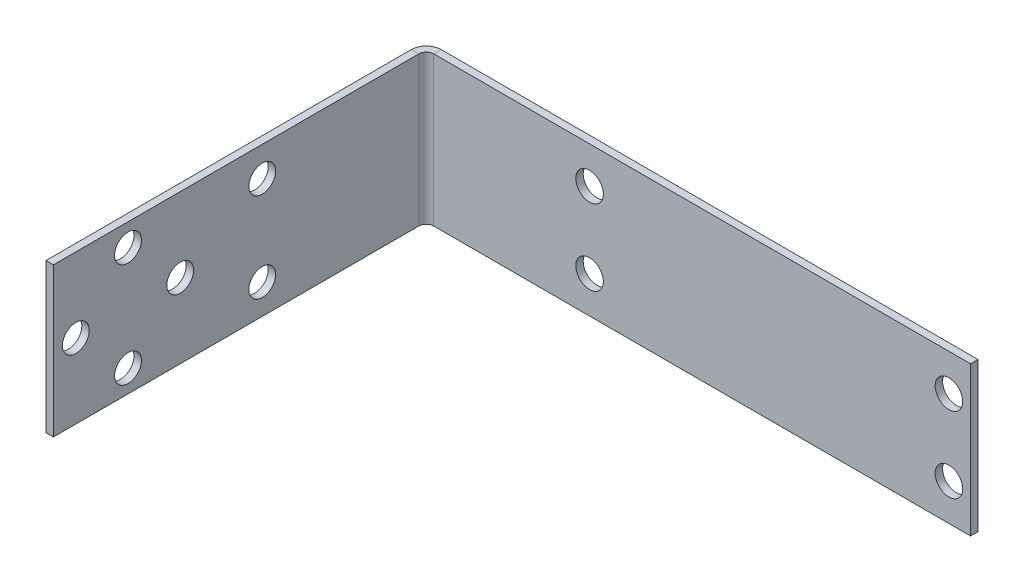
ISO-10303-21;
HEADER;
FILE_DESCRIPTION(('STEP AP214'),'2;1');
FILE_NAME('part.step','',(''),(''),'','','');
FILE_SCHEMA(('AUTOMOTIVE_DESIGN { 1 0 10303 214 1 1 1 1 }'));
ENDSEC;
DATA;
#1=APPLICATION_CONTEXT('core data for automotive mechanical design processes');
#2=APPLICATION_PROTOCOL_DEFINITION('international standard','automotive_design',2000,#1);
#3=PRODUCT_CONTEXT('',#1,'mechanical');
#4=PRODUCT('Part','Part','',(#3));
#5=PRODUCT_RELATED_PRODUCT_CATEGORY('part','',(#4));
#6=PRODUCT_DEFINITION_FORMATION('','',#4);
#7=PRODUCT_DEFINITION_CONTEXT('part definition',#1,'design');
#8=PRODUCT_DEFINITION('design','',#6,#7);
#9=PRODUCT_DEFINITION_SHAPE('','',#8);
#10=(LENGTH_UNIT() NAMED_UNIT(*) SI_UNIT(.MILLI.,.METRE.));
#11=(NAMED_UNIT(*) PLANE_ANGLE_UNIT() SI_UNIT($,.RADIAN.));
#12=(NAMED_UNIT(*) SI_UNIT($,.STERADIAN.) SOLID_ANGLE_UNIT());
#13=UNCERTAINTY_MEASURE_WITH_UNIT(LENGTH_MEASURE(1.E-05),#10,'distance_accuracy_value','');
#14=(GEOMETRIC_REPRESENTATION_CONTEXT(3) GLOBAL_UNCERTAINTY_ASSIGNED_CONTEXT((#13)) GLOBAL_UNIT_ASSIGNED_CONTEXT((#10,
#11,#12)) REPRESENTATION_CONTEXT('',''));
#15=CARTESIAN_POINT('',(0.,0.,0.));
#16=DIRECTION('',(0.,0.,1.));
#17=DIRECTION('',(1.,0.,0.));
#18=AXIS2_PLACEMENT_3D('',#15,#16,#17);
#19=CARTESIAN_POINT('',(1.,0.,0.));
#20=DIRECTION('',(0.,1.,0.));
#21=DIRECTION('',(0.,0.,1.));
#22=AXIS2_PLACEMENT_3D('',#19,#20,#21);
#23=PLANE('',#22);
#24=DIRECTION('',(-1.,0.,0.));
#25=VECTOR('',#24,1.);
#26=CARTESIAN_POINT('',(0.999999999999991,0.,-49.));
#27=LINE('',#26,#25);
#28=CARTESIAN_POINT('',(1.99999999999999,0.,-49.));
#29=VERTEX_POINT('',#28);
#30=CARTESIAN_POINT('',(0.999999999999991,0.,-49.));
#31=VERTEX_POINT('',#30);
#32=EDGE_CURVE('E12',#29,#31,#27,.T.);
#33=ORIENTED_EDGE('',*,*,#32,.F.);
#34=DIRECTION('',(0.,0.,-1.));
#35=VECTOR('',#34,1.);
#36=CARTESIAN_POINT('',(2.,0.,0.));
#37=LINE('',#36,#35);
#38=CARTESIAN_POINT('',(2.,0.,0.));
#39=VERTEX_POINT('',#38);
#40=EDGE_CURVE('E90',#29,#39,#37,.F.);
#41=ORIENTED_EDGE('',*,*,#40,.T.);
#42=DIRECTION('',(-1.,0.,0.));
#43=VECTOR('',#42,1.);
#44=CARTESIAN_POINT('',(1.,0.,0.));
#45=LINE('',#44,#43);
#46=CARTESIAN_POINT('',(1.,0.,0.));
#47=VERTEX_POINT('',#46);
#48=EDGE_CURVE('E50',#39,#47,#45,.T.);
#49=ORIENTED_EDGE('',*,*,#48,.T.);
#50=DIRECTION('',(0.,0.,1.));
#51=VECTOR('',#50,1.);
#52=CARTESIAN_POINT('',(1.,0.,0.));
#53=LINE('',#52,#51);
#54=EDGE_CURVE('E93',#31,#47,#53,.T.);
#55=ORIENTED_EDGE('',*,*,#54,.F.);
#56=EDGE_LOOP('',(#33,#41,#49,#55));
#57=FACE_BOUND('',#56,.T.);
#58=ADVANCED_FACE('F40',(#57),#23,.F.);
#59=CARTESIAN_POINT('',(1.,20.,0.));
#60=DIRECTION('',(0.,0.,1.));
#61=DIRECTION('',(0.,-1.,0.));
#62=AXIS2_PLACEMENT_3D('',#59,#60,#61);
#63=PLANE('',#62);
#64=ORIENTED_EDGE('',*,*,#48,.F.);
#65=DIRECTION('',(0.,1.,0.));
#66=VECTOR('',#65,1.);
#67=CARTESIAN_POINT('',(2.,20.,0.));
#68=LINE('',#67,#66);
#69=CARTESIAN_POINT('',(2.,20.,0.));
#70=VERTEX_POINT('',#69);
#71=EDGE_CURVE('E118',#70,#39,#68,.F.);
#72=ORIENTED_EDGE('',*,*,#71,.F.);
#73=DIRECTION('',(-1.,0.,0.));
#74=VECTOR('',#73,1.);
#75=CARTESIAN_POINT('',(1.,20.,0.));
#76=LINE('',#75,#74);
#77=CARTESIAN_POINT('',(1.,20.,0.));
#78=VERTEX_POINT('',#77);
#79=EDGE_CURVE('E153',#70,#78,#76,.T.);
#80=ORIENTED_EDGE('',*,*,#79,.T.);
#81=DIRECTION('',(0.,-1.,0.));
#82=VECTOR('',#81,1.);
#83=CARTESIAN_POINT('',(1.,20.,0.));
#84=LINE('',#83,#82);
#85=EDGE_CURVE('E164',#78,#47,#84,.T.);
#86=ORIENTED_EDGE('',*,*,#85,.T.);
#87=EDGE_LOOP('',(#64,#72,#80,#86));
#88=FACE_BOUND('',#87,.T.);
#89=ADVANCED_FACE('F170',(#88),#63,.T.);
#90=CARTESIAN_POINT('',(1.,20.,0.));
#91=DIRECTION('',(0.,1.,0.));
#92=DIRECTION('',(0.,0.,1.));
#93=AXIS2_PLACEMENT_3D('',#90,#91,#92);
#94=PLANE('',#93);
#95=ORIENTED_EDGE('',*,*,#79,.F.);
#96=DIRECTION('',(0.,0.,-1.));
#97=VECTOR('',#96,1.);
#98=CARTESIAN_POINT('',(2.,20.,0.));
#99=LINE('',#98,#97);
#100=CARTESIAN_POINT('',(1.99999999999999,20.,-49.));
#101=VERTEX_POINT('',#100);
#102=EDGE_CURVE('E211',#101,#70,#99,.F.);
#103=ORIENTED_EDGE('',*,*,#102,.F.);
#104=DIRECTION('',(-1.,0.,0.));
#105=VECTOR('',#104,1.);
#106=CARTESIAN_POINT('',(0.999999999999991,20.,-49.));
#107=LINE('',#106,#105);
#108=CARTESIAN_POINT('',(0.999999999999991,20.,-49.));
#109=VERTEX_POINT('',#108);
#110=EDGE_CURVE('E150',#101,#109,#107,.T.);
#111=ORIENTED_EDGE('',*,*,#110,.T.);
#112=DIRECTION('',(0.,0.,1.));
#113=VECTOR('',#112,1.);
#114=CARTESIAN_POINT('',(1.,20.,0.));
#115=LINE('',#114,#113);
#116=EDGE_CURVE('E171',#109,#78,#115,.T.);
#117=ORIENTED_EDGE('',*,*,#116,.T.);
#118=EDGE_LOOP('',(#95,#103,#111,#117));
#119=FACE_BOUND('',#118,.T.);
#120=ADVANCED_FACE('F228',(#119),#94,.T.);
#121=CARTESIAN_POINT('',(2.99999999999999,20.,-49.));
#122=DIRECTION('',(0.,-1.,0.));
#123=DIRECTION('',(0.,0.,-1.));
#124=AXIS2_PLACEMENT_3D('',#121,#122,#123);
#125=PLANE('',#124);
#126=ORIENTED_EDGE('',*,*,#110,.F.);
#127=CARTESIAN_POINT('',(2.99999999999999,20.,-49.));
#128=DIRECTION('',(0.,-1.,0.));
#129=DIRECTION('',(0.,0.,-1.));
#130=AXIS2_PLACEMENT_3D('',#127,#128,#129);
#131=CIRCLE('',#130,1.);
#132=CARTESIAN_POINT('',(2.99999999999999,20.,-50.));
#133=VERTEX_POINT('',#132);
#134=EDGE_CURVE('E108',#101,#133,#131,.T.);
#135=ORIENTED_EDGE('',*,*,#134,.T.);
#136=DIRECTION('',(0.,0.,-1.));
#137=VECTOR('',#136,1.);
#138=CARTESIAN_POINT('',(2.99999999999999,20.,-51.));
#139=LINE('',#138,#137);
#140=CARTESIAN_POINT('',(2.99999999999999,20.,-51.));
#141=VERTEX_POINT('',#140);
#142=EDGE_CURVE('E58',#133,#141,#139,.T.);
#143=ORIENTED_EDGE('',*,*,#142,.T.);
#144=CARTESIAN_POINT('',(2.99999999999999,20.,-49.));
#145=DIRECTION('',(0.,1.,0.));
#146=DIRECTION('',(0.,0.,1.));
#147=AXIS2_PLACEMENT_3D('',#144,#145,#146);
#148=CIRCLE('',#147,2.);
#149=EDGE_CURVE('E203',#109,#141,#148,.F.);
#150=ORIENTED_EDGE('',*,*,#149,.F.);
#151=EDGE_LOOP('',(#126,#135,#143,#150));
#152=FACE_BOUND('',#151,.T.);
#153=ADVANCED_FACE('F231',(#152),#125,.F.);
#154=CARTESIAN_POINT('',(0.999999999999991,20.,-51.));
#155=DIRECTION('',(0.,1.,0.));
#156=DIRECTION('',(-1.,0.,0.));
#157=AXIS2_PLACEMENT_3D('',#154,#155,#156);
#158=PLANE('',#157);
#159=ORIENTED_EDGE('',*,*,#142,.F.);
#160=DIRECTION('',(1.,0.,0.));
#161=VECTOR('',#160,1.);
#162=CARTESIAN_POINT('',(0.999999999999991,20.,-50.));
#163=LINE('',#162,#161);
#164=CARTESIAN_POINT('',(75.,20.,-50.));
#165=VERTEX_POINT('',#164);
#166=EDGE_CURVE('E222',#165,#133,#163,.F.);
#167=ORIENTED_EDGE('',*,*,#166,.F.);
#168=DIRECTION('',(0.,0.,-1.));
#169=VECTOR('',#168,1.);
#170=CARTESIAN_POINT('',(75.,20.,-51.));
#171=LINE('',#170,#169);
#172=CARTESIAN_POINT('',(75.,20.,-51.));
#173=VERTEX_POINT('',#172);
#174=EDGE_CURVE('E146',#165,#173,#171,.T.);
#175=ORIENTED_EDGE('',*,*,#174,.T.);
#176=DIRECTION('',(-1.,0.,0.));
#177=VECTOR('',#176,1.);
#178=CARTESIAN_POINT('',(0.999999999999991,20.,-51.));
#179=LINE('',#178,#177);
#180=EDGE_CURVE('E191',#173,#141,#179,.T.);
#181=ORIENTED_EDGE('',*,*,#180,.T.);
#182=EDGE_LOOP('',(#159,#167,#175,#181));
#183=FACE_BOUND('',#182,.T.);
#184=ADVANCED_FACE('F242',(#183),#158,.T.);
#185=CARTESIAN_POINT('',(75.,20.,-51.));
#186=DIRECTION('',(-1.,0.,0.));
#187=DIRECTION('',(0.,-1.,0.));
#188=AXIS2_PLACEMENT_3D('',#185,#186,#187);
#189=PLANE('',#188);
#190=ORIENTED_EDGE('',*,*,#174,.F.);
#191=DIRECTION('',(0.,1.,0.));
#192=VECTOR('',#191,1.);
#193=CARTESIAN_POINT('',(75.,20.,-50.));
#194=LINE('',#193,#192);
#195=CARTESIAN_POINT('',(75.,0.,-50.));
#196=VERTEX_POINT('',#195);
#197=EDGE_CURVE('E113',#165,#196,#194,.F.);
#198=ORIENTED_EDGE('',*,*,#197,.T.);
#199=DIRECTION('',(0.,0.,-1.));
#200=VECTOR('',#199,1.);
#201=CARTESIAN_POINT('',(75.,0.,-51.));
#202=LINE('',#201,#200);
#203=CARTESIAN_POINT('',(75.,0.,-51.));
#204=VERTEX_POINT('',#203);
#205=EDGE_CURVE('E143',#196,#204,#202,.T.);
#206=ORIENTED_EDGE('',*,*,#205,.T.);
#207=DIRECTION('',(0.,-1.,0.));
#208=VECTOR('',#207,1.);
#209=CARTESIAN_POINT('',(75.,20.,-51.));
#210=LINE('',#209,#208);
#211=EDGE_CURVE('E194',#173,#204,#210,.T.);
#212=ORIENTED_EDGE('',*,*,#211,.F.);
#213=EDGE_LOOP('',(#190,#198,#206,#212));
#214=FACE_BOUND('',#213,.T.);
#215=ADVANCED_FACE('F248',(#214),#189,.F.);
#216=CARTESIAN_POINT('',(0.999999999999991,0.,-51.));
#217=DIRECTION('',(0.,1.,0.));
#218=DIRECTION('',(-1.,0.,0.));
#219=AXIS2_PLACEMENT_3D('',#216,#217,#218);
#220=PLANE('',#219);
#221=ORIENTED_EDGE('',*,*,#205,.F.);
#222=DIRECTION('',(1.,0.,0.));
#223=VECTOR('',#222,1.);
#224=CARTESIAN_POINT('',(0.999999999999991,0.,-50.));
#225=LINE('',#224,#223);
#226=CARTESIAN_POINT('',(2.99999999999999,0.,-50.));
#227=VERTEX_POINT('',#226);
#228=EDGE_CURVE('E220',#196,#227,#225,.F.);
#229=ORIENTED_EDGE('',*,*,#228,.T.);
#230=DIRECTION('',(0.,0.,-1.));
#231=VECTOR('',#230,1.);
#232=CARTESIAN_POINT('',(2.99999999999999,0.,-51.));
#233=LINE('',#232,#231);
#234=CARTESIAN_POINT('',(2.99999999999999,0.,-51.));
#235=VERTEX_POINT('',#234);
#236=EDGE_CURVE('E44',#227,#235,#233,.T.);
#237=ORIENTED_EDGE('',*,*,#236,.T.);
#238=DIRECTION('',(-1.,0.,0.));
#239=VECTOR('',#238,1.);
#240=CARTESIAN_POINT('',(0.999999999999991,0.,-51.));
#241=LINE('',#240,#239);
#242=EDGE_CURVE('E188',#204,#235,#241,.T.);
#243=ORIENTED_EDGE('',*,*,#242,.F.);
#244=EDGE_LOOP('',(#221,#229,#237,#243));
#245=FACE_BOUND('',#244,.T.);
#246=ADVANCED_FACE('F252',(#245),#220,.F.);
#247=CARTESIAN_POINT('',(1.,10.,-17.));
#248=DIRECTION('',(1.,0.,0.));
#249=DIRECTION('',(0.,0.,-1.));
#250=AXIS2_PLACEMENT_3D('',#247,#248,#249);
#251=CYLINDRICAL_SURFACE('',#250,1.8);
#252=CARTESIAN_POINT('',(1.,10.,-17.));
#253=DIRECTION('',(-1.,0.,0.));
#254=DIRECTION('',(0.,0.,1.));
#255=AXIS2_PLACEMENT_3D('',#252,#253,#254);
#256=CIRCLE('',#255,1.8);
#257=CARTESIAN_POINT('',(1.,10.,-15.2));
#258=VERTEX_POINT('',#257);
#259=EDGE_CURVE('E205',#258,#258,#256,.T.);
#260=ORIENTED_EDGE('',*,*,#259,.T.);
#261=EDGE_LOOP('',(#260));
#262=FACE_BOUND('',#261,.T.);
#263=CARTESIAN_POINT('',(2.,10.,-17.));
#264=DIRECTION('',(-1.,0.,0.));
#265=DIRECTION('',(0.,0.,1.));
#266=AXIS2_PLACEMENT_3D('',#263,#264,#265);
#267=CIRCLE('',#266,1.8);
#268=CARTESIAN_POINT('',(2.,10.,-15.2));
#269=VERTEX_POINT('',#268);
#270=EDGE_CURVE('E126',#269,#269,#267,.T.);
#271=ORIENTED_EDGE('',*,*,#270,.F.);
#272=EDGE_LOOP('',(#271));
#273=FACE_BOUND('',#272,.T.);
#274=ADVANCED_FACE('F277',(#262,#273),#251,.F.);
#275=CARTESIAN_POINT('',(1.,17.,-10.));
#276=DIRECTION('',(1.,0.,0.));
#277=DIRECTION('',(0.,0.,-1.));
#278=AXIS2_PLACEMENT_3D('',#275,#276,#277);
#279=CYLINDRICAL_SURFACE('',#278,1.8);
#280=CARTESIAN_POINT('',(1.,17.,-10.));
#281=DIRECTION('',(-1.,0.,0.));
#282=DIRECTION('',(0.,0.,1.));
#283=AXIS2_PLACEMENT_3D('',#280,#281,#282);
#284=CIRCLE('',#283,1.8);
#285=CARTESIAN_POINT('',(1.,17.,-8.2));
#286=VERTEX_POINT('',#285);
#287=EDGE_CURVE('E302',#286,#286,#284,.T.);
#288=ORIENTED_EDGE('',*,*,#287,.T.);
#289=EDGE_LOOP('',(#288));
#290=FACE_BOUND('',#289,.T.);
#291=CARTESIAN_POINT('',(2.,17.,-10.));
#292=DIRECTION('',(-1.,0.,0.));
#293=DIRECTION('',(0.,0.,1.));
#294=AXIS2_PLACEMENT_3D('',#291,#292,#293);
#295=CIRCLE('',#294,1.8);
#296=CARTESIAN_POINT('',(2.,17.,-8.2));
#297=VERTEX_POINT('',#296);
#298=EDGE_CURVE('E135',#297,#297,#295,.T.);
#299=ORIENTED_EDGE('',*,*,#298,.F.);
#300=EDGE_LOOP('',(#299));
#301=FACE_BOUND('',#300,.T.);
#302=ADVANCED_FACE('F280',(#290,#301),#279,.F.);
#303=CARTESIAN_POINT('',(1.,10.,-3.));
#304=DIRECTION('',(1.,0.,0.));
#305=DIRECTION('',(0.,0.,-1.));
#306=AXIS2_PLACEMENT_3D('',#303,#304,#305);
#307=CYLINDRICAL_SURFACE('',#306,1.8);
#308=CARTESIAN_POINT('',(1.,10.,-3.));
#309=DIRECTION('',(-1.,0.,0.));
#310=DIRECTION('',(0.,0.,1.));
#311=AXIS2_PLACEMENT_3D('',#308,#309,#310);
#312=CIRCLE('',#311,1.8);
#313=CARTESIAN_POINT('',(1.,10.,-1.2));
#314=VERTEX_POINT('',#313);
#315=EDGE_CURVE('E295',#314,#314,#312,.T.);
#316=ORIENTED_EDGE('',*,*,#315,.T.);
#317=EDGE_LOOP('',(#316));
#318=FACE_BOUND('',#317,.T.);
#319=CARTESIAN_POINT('',(2.,10.,-3.));
#320=DIRECTION('',(-1.,0.,0.));
#321=DIRECTION('',(0.,0.,1.));
#322=AXIS2_PLACEMENT_3D('',#319,#320,#321);
#323=CIRCLE('',#322,1.8);
#324=CARTESIAN_POINT('',(2.,10.,-1.2));
#325=VERTEX_POINT('',#324);
#326=EDGE_CURVE('E138',#325,#325,#323,.T.);
#327=ORIENTED_EDGE('',*,*,#326,.F.);
#328=EDGE_LOOP('',(#327));
#329=FACE_BOUND('',#328,.T.);
#330=ADVANCED_FACE('F283',(#318,#329),#307,.F.);
#331=CARTESIAN_POINT('',(1.,3.,-10.));
#332=DIRECTION('',(1.,0.,0.));
#333=DIRECTION('',(0.,0.,-1.));
#334=AXIS2_PLACEMENT_3D('',#331,#332,#333);
#335=CYLINDRICAL_SURFACE('',#334,1.8);
#336=CARTESIAN_POINT('',(1.,3.,-10.));
#337=DIRECTION('',(-1.,0.,0.));
#338=DIRECTION('',(0.,0.,1.));
#339=AXIS2_PLACEMENT_3D('',#336,#337,#338);
#340=CIRCLE('',#339,1.8);
#341=CARTESIAN_POINT('',(1.,3.,-8.2));
#342=VERTEX_POINT('',#341);
#343=EDGE_CURVE('E168',#342,#342,#340,.T.);
#344=ORIENTED_EDGE('',*,*,#343,.T.);
#345=EDGE_LOOP('',(#344));
#346=FACE_BOUND('',#345,.T.);
#347=CARTESIAN_POINT('',(2.,3.,-10.));
#348=DIRECTION('',(-1.,0.,0.));
#349=DIRECTION('',(0.,0.,1.));
#350=AXIS2_PLACEMENT_3D('',#347,#348,#349);
#351=CIRCLE('',#350,1.8);
#352=CARTESIAN_POINT('',(2.,3.,-8.2));
#353=VERTEX_POINT('',#352);
#354=EDGE_CURVE('E119',#353,#353,#351,.T.);
#355=ORIENTED_EDGE('',*,*,#354,.F.);
#356=EDGE_LOOP('',(#355));
#357=FACE_BOUND('',#356,.T.);
#358=ADVANCED_FACE('F42',(#346,#357),#335,.F.);
#359=CARTESIAN_POINT('',(23.9,15.075,-51.));
#360=DIRECTION('',(0.,0.,1.));
#361=DIRECTION('',(1.,0.,0.));
#362=AXIS2_PLACEMENT_3D('',#359,#360,#361);
#363=CYLINDRICAL_SURFACE('',#362,1.85);
#364=CARTESIAN_POINT('',(23.9,15.075,-51.));
#365=DIRECTION('',(0.,0.,-1.));
#366=DIRECTION('',(-1.,0.,0.));
#367=AXIS2_PLACEMENT_3D('',#364,#365,#366);
#368=CIRCLE('',#367,1.85);
#369=CARTESIAN_POINT('',(22.05,15.075,-51.));
#370=VERTEX_POINT('',#369);
#371=EDGE_CURVE('E173',#370,#370,#368,.T.);
#372=ORIENTED_EDGE('',*,*,#371,.T.);
#373=EDGE_LOOP('',(#372));
#374=FACE_BOUND('',#373,.T.);
#375=CARTESIAN_POINT('',(23.9,15.075,-50.));
#376=DIRECTION('',(0.,0.,-1.));
#377=DIRECTION('',(-1.,0.,0.));
#378=AXIS2_PLACEMENT_3D('',#375,#376,#377);
#379=CIRCLE('',#378,1.85);
#380=CARTESIAN_POINT('',(22.05,15.075,-50.));
#381=VERTEX_POINT('',#380);
#382=EDGE_CURVE('E207',#381,#381,#379,.T.);
#383=ORIENTED_EDGE('',*,*,#382,.F.);
#384=EDGE_LOOP('',(#383));
#385=FACE_BOUND('',#384,.T.);
#386=ADVANCED_FACE('F290',(#374,#385),#363,.F.);
#387=CARTESIAN_POINT('',(23.9,4.925,-51.));
#388=DIRECTION('',(0.,0.,1.));
#389=DIRECTION('',(1.,0.,0.));
#390=AXIS2_PLACEMENT_3D('',#387,#388,#389);
#391=CYLINDRICAL_SURFACE('',#390,1.85);
#392=CARTESIAN_POINT('',(23.9,4.925,-51.));
#393=DIRECTION('',(0.,0.,-1.));
#394=DIRECTION('',(-1.,0.,0.));
#395=AXIS2_PLACEMENT_3D('',#392,#393,#394);
#396=CIRCLE('',#395,1.85);
#397=CARTESIAN_POINT('',(22.05,4.925,-51.));
#398=VERTEX_POINT('',#397);
#399=EDGE_CURVE('E179',#398,#398,#396,.T.);
#400=ORIENTED_EDGE('',*,*,#399,.T.);
#401=EDGE_LOOP('',(#400));
#402=FACE_BOUND('',#401,.T.);
#403=CARTESIAN_POINT('',(23.9,4.925,-50.));
#404=DIRECTION('',(0.,0.,-1.));
#405=DIRECTION('',(-1.,0.,0.));
#406=AXIS2_PLACEMENT_3D('',#403,#404,#405);
#407=CIRCLE('',#406,1.85);
#408=CARTESIAN_POINT('',(22.05,4.925,-50.));
#409=VERTEX_POINT('',#408);
#410=EDGE_CURVE('E210',#409,#409,#407,.T.);
#411=ORIENTED_EDGE('',*,*,#410,.F.);
#412=EDGE_LOOP('',(#411));
#413=FACE_BOUND('',#412,.T.);
#414=ADVANCED_FACE('F366',(#402,#413),#391,.F.);
#415=CARTESIAN_POINT('',(72.1,4.925,-51.));
#416=DIRECTION('',(0.,0.,1.));
#417=DIRECTION('',(1.,0.,0.));
#418=AXIS2_PLACEMENT_3D('',#415,#416,#417);
#419=CYLINDRICAL_SURFACE('',#418,1.85);
#420=CARTESIAN_POINT('',(72.1,4.925,-51.));
#421=DIRECTION('',(0.,0.,-1.));
#422=DIRECTION('',(-1.,0.,0.));
#423=AXIS2_PLACEMENT_3D('',#420,#421,#422);
#424=CIRCLE('',#423,1.85);
#425=CARTESIAN_POINT('',(70.25,4.925,-51.));
#426=VERTEX_POINT('',#425);
#427=EDGE_CURVE('E182',#426,#426,#424,.T.);
#428=ORIENTED_EDGE('',*,*,#427,.T.);
#429=EDGE_LOOP('',(#428));
#430=FACE_BOUND('',#429,.T.);
#431=CARTESIAN_POINT('',(72.1,4.925,-50.));
#432=DIRECTION('',(0.,0.,-1.));
#433=DIRECTION('',(-1.,0.,0.));
#434=AXIS2_PLACEMENT_3D('',#431,#432,#433);
#435=CIRCLE('',#434,1.85);
#436=CARTESIAN_POINT('',(70.25,4.925,-50.));
#437=VERTEX_POINT('',#436);
#438=EDGE_CURVE('E214',#437,#437,#435,.T.);
#439=ORIENTED_EDGE('',*,*,#438,.F.);
#440=EDGE_LOOP('',(#439));
#441=FACE_BOUND('',#440,.T.);
#442=ADVANCED_FACE('F359',(#430,#441),#419,.F.);
#443=CARTESIAN_POINT('',(72.1,15.075,-51.));
#444=DIRECTION('',(0.,0.,1.));
#445=DIRECTION('',(1.,0.,0.));
#446=AXIS2_PLACEMENT_3D('',#443,#444,#445);
#447=CYLINDRICAL_SURFACE('',#446,1.85);
#448=CARTESIAN_POINT('',(72.1,15.075,-51.));
#449=DIRECTION('',(0.,0.,-1.));
#450=DIRECTION('',(-1.,0.,0.));
#451=AXIS2_PLACEMENT_3D('',#448,#449,#450);
#452=CIRCLE('',#451,1.85);
#453=CARTESIAN_POINT('',(70.25,15.075,-51.));
#454=VERTEX_POINT('',#453);
#455=EDGE_CURVE('E185',#454,#454,#452,.T.);
#456=ORIENTED_EDGE('',*,*,#455,.T.);
#457=EDGE_LOOP('',(#456));
#458=FACE_BOUND('',#457,.T.);
#459=CARTESIAN_POINT('',(72.1,15.075,-50.));
#460=DIRECTION('',(0.,0.,-1.));
#461=DIRECTION('',(-1.,0.,0.));
#462=AXIS2_PLACEMENT_3D('',#459,#460,#461);
#463=CIRCLE('',#462,1.85);
#464=CARTESIAN_POINT('',(70.25,15.075,-50.));
#465=VERTEX_POINT('',#464);
#466=EDGE_CURVE('E217',#465,#465,#463,.T.);
#467=ORIENTED_EDGE('',*,*,#466,.F.);
#468=EDGE_LOOP('',(#467));
#469=FACE_BOUND('',#468,.T.);
#470=ADVANCED_FACE('F276',(#458,#469),#447,.F.);
#471=CARTESIAN_POINT('',(2.99999999999999,0.,-49.));
#472=DIRECTION('',(0.,1.,0.));
#473=DIRECTION('',(0.,0.,1.));
#474=AXIS2_PLACEMENT_3D('',#471,#472,#473);
#475=PLANE('',#474);
#476=CARTESIAN_POINT('',(2.99999999999999,0.,-49.));
#477=DIRECTION('',(0.,-1.,0.));
#478=DIRECTION('',(0.,0.,-1.));
#479=AXIS2_PLACEMENT_3D('',#476,#477,#478);
#480=CIRCLE('',#479,1.);
#481=EDGE_CURVE('E106',#227,#29,#480,.F.);
#482=ORIENTED_EDGE('',*,*,#481,.T.);
#483=ORIENTED_EDGE('',*,*,#32,.T.);
#484=CARTESIAN_POINT('',(2.99999999999999,0.,-49.));
#485=DIRECTION('',(0.,-1.,0.));
#486=DIRECTION('',(0.,0.,-1.));
#487=AXIS2_PLACEMENT_3D('',#484,#485,#486);
#488=CIRCLE('',#487,2.);
#489=EDGE_CURVE('E201',#235,#31,#488,.F.);
#490=ORIENTED_EDGE('',*,*,#489,.F.);
#491=ORIENTED_EDGE('',*,*,#236,.F.);
#492=EDGE_LOOP('',(#482,#483,#490,#491));
#493=FACE_BOUND('',#492,.T.);
#494=ADVANCED_FACE('F122',(#493),#475,.F.);
#495=CARTESIAN_POINT('',(0.999999999999991,20.,-51.));
#496=DIRECTION('',(0.,0.,1.));
#497=DIRECTION('',(1.,0.,0.));
#498=AXIS2_PLACEMENT_3D('',#495,#496,#497);
#499=PLANE('',#498);
#500=ORIENTED_EDGE('',*,*,#371,.F.);
#501=EDGE_LOOP('',(#500));
#502=FACE_BOUND('',#501,.T.);
#503=ORIENTED_EDGE('',*,*,#399,.F.);
#504=EDGE_LOOP('',(#503));
#505=FACE_BOUND('',#504,.T.);
#506=ORIENTED_EDGE('',*,*,#427,.F.);
#507=EDGE_LOOP('',(#506));
#508=FACE_BOUND('',#507,.T.);
#509=ORIENTED_EDGE('',*,*,#455,.F.);
#510=EDGE_LOOP('',(#509));
#511=FACE_BOUND('',#510,.T.);
#512=ORIENTED_EDGE('',*,*,#242,.T.);
#513=DIRECTION('',(0.,-1.,0.));
#514=VECTOR('',#513,1.);
#515=CARTESIAN_POINT('',(2.99999999999999,20.,-51.));
#516=LINE('',#515,#514);
#517=EDGE_CURVE('E198',#235,#141,#516,.F.);
#518=ORIENTED_EDGE('',*,*,#517,.T.);
#519=ORIENTED_EDGE('',*,*,#180,.F.);
#520=ORIENTED_EDGE('',*,*,#211,.T.);
#521=EDGE_LOOP('',(#512,#518,#519,#520));
#522=FACE_BOUND('',#521,.T.);
#523=ADVANCED_FACE('F247',(#502,#505,#508,#511,#522),#499,.F.);
#524=CARTESIAN_POINT('',(1.,20.,0.));
#525=DIRECTION('',(1.,0.,0.));
#526=DIRECTION('',(0.,0.,-1.));
#527=AXIS2_PLACEMENT_3D('',#524,#525,#526);
#528=PLANE('',#527);
#529=CARTESIAN_POINT('',(0.999999999999991,16.,-28.));
#530=DIRECTION('',(1.,0.,0.));
#531=DIRECTION('',(0.,0.,-1.));
#532=AXIS2_PLACEMENT_3D('',#529,#530,#531);
#533=CIRCLE('',#532,1.8);
#534=CARTESIAN_POINT('',(0.999999999999991,16.,-29.8));
#535=VERTEX_POINT('',#534);
#536=EDGE_CURVE('E124',#535,#535,#533,.T.);
#537=ORIENTED_EDGE('',*,*,#536,.T.);
#538=EDGE_LOOP('',(#537));
#539=FACE_BOUND('',#538,.T.);
#540=CARTESIAN_POINT('',(0.999999999999991,4.,-28.));
#541=DIRECTION('',(1.,0.,0.));
#542=DIRECTION('',(0.,0.,-1.));
#543=AXIS2_PLACEMENT_3D('',#540,#541,#542);
#544=CIRCLE('',#543,1.8);
#545=CARTESIAN_POINT('',(0.999999999999991,4.,-29.8));
#546=VERTEX_POINT('',#545);
#547=EDGE_CURVE('E313',#546,#546,#544,.T.);
#548=ORIENTED_EDGE('',*,*,#547,.T.);
#549=EDGE_LOOP('',(#548));
#550=FACE_BOUND('',#549,.T.);
#551=ORIENTED_EDGE('',*,*,#259,.F.);
#552=EDGE_LOOP('',(#551));
#553=FACE_BOUND('',#552,.T.);
#554=ORIENTED_EDGE('',*,*,#287,.F.);
#555=EDGE_LOOP('',(#554));
#556=FACE_BOUND('',#555,.T.);
#557=ORIENTED_EDGE('',*,*,#315,.F.);
#558=EDGE_LOOP('',(#557));
#559=FACE_BOUND('',#558,.T.);
#560=ORIENTED_EDGE('',*,*,#343,.F.);
#561=EDGE_LOOP('',(#560));
#562=FACE_BOUND('',#561,.T.);
#563=ORIENTED_EDGE('',*,*,#116,.F.);
#564=DIRECTION('',(0.,-1.,0.));
#565=VECTOR('',#564,1.);
#566=CARTESIAN_POINT('',(0.999999999999991,20.,-49.));
#567=LINE('',#566,#565);
#568=EDGE_CURVE('E167',#109,#31,#567,.T.);
#569=ORIENTED_EDGE('',*,*,#568,.T.);
#570=ORIENTED_EDGE('',*,*,#54,.T.);
#571=ORIENTED_EDGE('',*,*,#85,.F.);
#572=EDGE_LOOP('',(#563,#569,#570,#571));
#573=FACE_BOUND('',#572,.T.);
#574=ADVANCED_FACE('F163',(#539,#550,#553,#556,#559,#562,#573),#528,.F.);
#575=CARTESIAN_POINT('',(2.99999999999999,20.,-49.));
#576=DIRECTION('',(0.,-1.,0.));
#577=DIRECTION('',(0.,0.,-1.));
#578=AXIS2_PLACEMENT_3D('',#575,#576,#577);
#579=CYLINDRICAL_SURFACE('',#578,2.);
#580=ORIENTED_EDGE('',*,*,#149,.T.);
#581=ORIENTED_EDGE('',*,*,#517,.F.);
#582=ORIENTED_EDGE('',*,*,#489,.T.);
#583=ORIENTED_EDGE('',*,*,#568,.F.);
#584=EDGE_LOOP('',(#580,#581,#582,#583));
#585=FACE_BOUND('',#584,.T.);
#586=ADVANCED_FACE('F234',(#585),#579,.T.);
#587=CARTESIAN_POINT('',(0.999999999999991,20.,-50.));
#588=DIRECTION('',(0.,0.,1.));
#589=DIRECTION('',(1.,0.,0.));
#590=AXIS2_PLACEMENT_3D('',#587,#588,#589);
#591=PLANE('',#590);
#592=ORIENTED_EDGE('',*,*,#382,.T.);
#593=EDGE_LOOP('',(#592));
#594=FACE_BOUND('',#593,.T.);
#595=ORIENTED_EDGE('',*,*,#410,.T.);
#596=EDGE_LOOP('',(#595));
#597=FACE_BOUND('',#596,.T.);
#598=ORIENTED_EDGE('',*,*,#438,.T.);
#599=EDGE_LOOP('',(#598));
#600=FACE_BOUND('',#599,.T.);
#601=ORIENTED_EDGE('',*,*,#466,.T.);
#602=EDGE_LOOP('',(#601));
#603=FACE_BOUND('',#602,.T.);
#604=ORIENTED_EDGE('',*,*,#228,.F.);
#605=ORIENTED_EDGE('',*,*,#197,.F.);
#606=ORIENTED_EDGE('',*,*,#166,.T.);
#607=DIRECTION('',(0.,1.,0.));
#608=VECTOR('',#607,1.);
#609=CARTESIAN_POINT('',(2.99999999999999,20.,-50.));
#610=LINE('',#609,#608);
#611=EDGE_CURVE('E112',#227,#133,#610,.T.);
#612=ORIENTED_EDGE('',*,*,#611,.F.);
#613=EDGE_LOOP('',(#604,#605,#606,#612));
#614=FACE_BOUND('',#613,.T.);
#615=ADVANCED_FACE('F254',(#594,#597,#600,#603,#614),#591,.T.);
#616=CARTESIAN_POINT('',(2.,20.,0.));
#617=DIRECTION('',(1.,0.,0.));
#618=DIRECTION('',(0.,0.,-1.));
#619=AXIS2_PLACEMENT_3D('',#616,#617,#618);
#620=PLANE('',#619);
#621=CARTESIAN_POINT('',(2.,16.,-28.));
#622=DIRECTION('',(1.,0.,0.));
#623=DIRECTION('',(0.,0.,-1.));
#624=AXIS2_PLACEMENT_3D('',#621,#622,#623);
#625=CIRCLE('',#624,1.8);
#626=CARTESIAN_POINT('',(2.,16.,-29.8));
#627=VERTEX_POINT('',#626);
#628=EDGE_CURVE('E129',#627,#627,#625,.T.);
#629=ORIENTED_EDGE('',*,*,#628,.F.);
#630=EDGE_LOOP('',(#629));
#631=FACE_BOUND('',#630,.T.);
#632=CARTESIAN_POINT('',(2.,4.,-28.));
#633=DIRECTION('',(1.,0.,0.));
#634=DIRECTION('',(0.,0.,-1.));
#635=AXIS2_PLACEMENT_3D('',#632,#633,#634);
#636=CIRCLE('',#635,1.8);
#637=CARTESIAN_POINT('',(2.,4.,-29.8));
#638=VERTEX_POINT('',#637);
#639=EDGE_CURVE('E310',#638,#638,#636,.T.);
#640=ORIENTED_EDGE('',*,*,#639,.F.);
#641=EDGE_LOOP('',(#640));
#642=FACE_BOUND('',#641,.T.);
#643=ORIENTED_EDGE('',*,*,#270,.T.);
#644=EDGE_LOOP('',(#643));
#645=FACE_BOUND('',#644,.T.);
#646=ORIENTED_EDGE('',*,*,#298,.T.);
#647=EDGE_LOOP('',(#646));
#648=FACE_BOUND('',#647,.T.);
#649=ORIENTED_EDGE('',*,*,#326,.T.);
#650=EDGE_LOOP('',(#649));
#651=FACE_BOUND('',#650,.T.);
#652=ORIENTED_EDGE('',*,*,#354,.T.);
#653=EDGE_LOOP('',(#652));
#654=FACE_BOUND('',#653,.T.);
#655=ORIENTED_EDGE('',*,*,#102,.T.);
#656=ORIENTED_EDGE('',*,*,#71,.T.);
#657=ORIENTED_EDGE('',*,*,#40,.F.);
#658=DIRECTION('',(0.,1.,0.));
#659=VECTOR('',#658,1.);
#660=CARTESIAN_POINT('',(1.99999999999999,20.,-49.));
#661=LINE('',#660,#659);
#662=EDGE_CURVE('E103',#101,#29,#661,.F.);
#663=ORIENTED_EDGE('',*,*,#662,.F.);
#664=EDGE_LOOP('',(#655,#656,#657,#663));
#665=FACE_BOUND('',#664,.T.);
#666=ADVANCED_FACE('F116',(#631,#642,#645,#648,#651,#654,#665),#620,.T.);
#667=CARTESIAN_POINT('',(2.99999999999999,20.,-49.));
#668=DIRECTION('',(0.,-1.,0.));
#669=DIRECTION('',(0.,0.,-1.));
#670=AXIS2_PLACEMENT_3D('',#667,#668,#669);
#671=CYLINDRICAL_SURFACE('',#670,1.);
#672=ORIENTED_EDGE('',*,*,#134,.F.);
#673=ORIENTED_EDGE('',*,*,#662,.T.);
#674=ORIENTED_EDGE('',*,*,#481,.F.);
#675=ORIENTED_EDGE('',*,*,#611,.T.);
#676=EDGE_LOOP('',(#672,#673,#674,#675));
#677=FACE_BOUND('',#676,.T.);
#678=ADVANCED_FACE('F104',(#677),#671,.F.);
#679=CARTESIAN_POINT('',(0.999999999999991,4.,-28.));
#680=DIRECTION('',(1.,0.,0.));
#681=DIRECTION('',(0.,0.,-1.));
#682=AXIS2_PLACEMENT_3D('',#679,#680,#681);
#683=CYLINDRICAL_SURFACE('',#682,1.8);
#684=ORIENTED_EDGE('',*,*,#547,.F.);
#685=EDGE_LOOP('',(#684));
#686=FACE_BOUND('',#685,.T.);
#687=ORIENTED_EDGE('',*,*,#639,.T.);
#688=EDGE_LOOP('',(#687));
#689=FACE_BOUND('',#688,.T.);
#690=ADVANCED_FACE('F329',(#686,#689),#683,.F.);
#691=CARTESIAN_POINT('',(0.999999999999991,16.,-28.));
#692=DIRECTION('',(1.,0.,0.));
#693=DIRECTION('',(0.,0.,-1.));
#694=AXIS2_PLACEMENT_3D('',#691,#692,#693);
#695=CYLINDRICAL_SURFACE('',#694,1.8);
#696=ORIENTED_EDGE('',*,*,#536,.F.);
#697=EDGE_LOOP('',(#696));
#698=FACE_BOUND('',#697,.T.);
#699=ORIENTED_EDGE('',*,*,#628,.T.);
#700=EDGE_LOOP('',(#699));
#701=FACE_BOUND('',#700,.T.);
#702=ADVANCED_FACE('F319',(#698,#701),#695,.F.);
#703=CLOSED_SHELL('',(#58,#89,#120,#153,#184,#215,#246,#274,#302,#330,#358,#386,#414,#442,#470,
#494,#523,#574,#586,#615,#666,#678,#690,#702));
#704=MANIFOLD_SOLID_BREP('B2',#703);
#705=ADVANCED_BREP_SHAPE_REPRESENTATION('',(#18,#704),#14);
#706=SHAPE_DEFINITION_REPRESENTATION(#9,#705);
ENDSEC;
END-ISO-10303-21;
